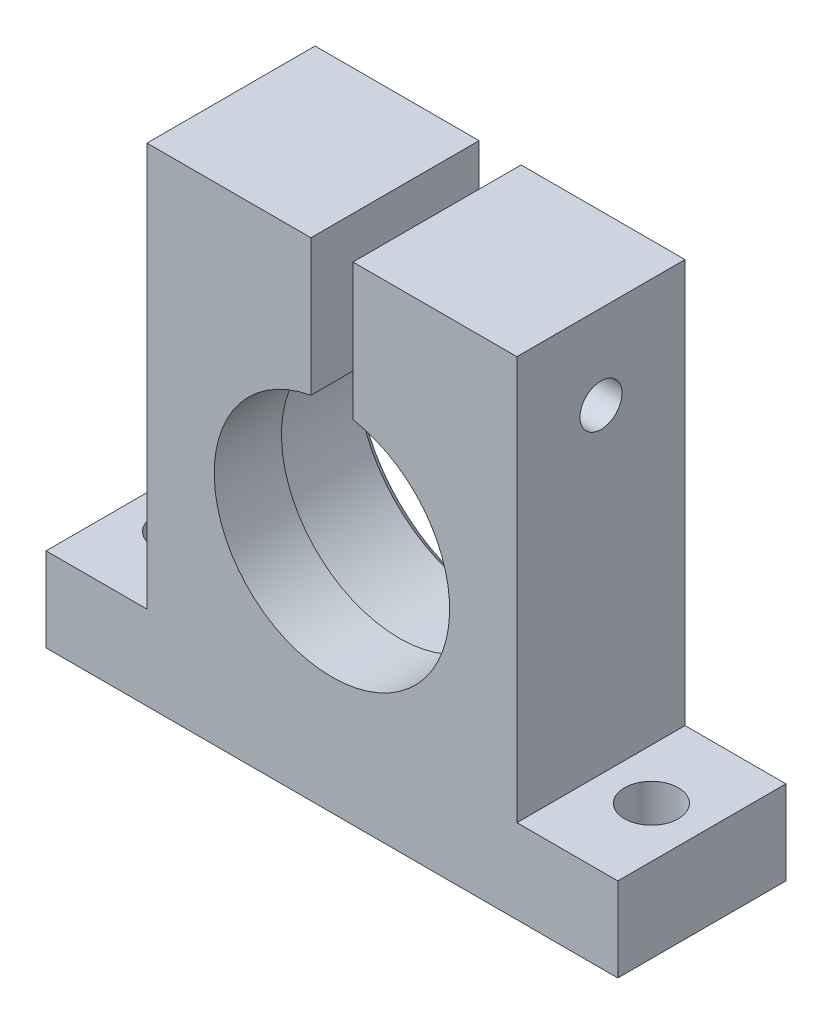
ISO-10303-21;
HEADER;
FILE_DESCRIPTION(('STEP AP214'),'2;1');
FILE_NAME('part.step','',(''),(''),'','','');
FILE_SCHEMA(('AUTOMOTIVE_DESIGN { 1 0 10303 214 1 1 1 1 }'));
ENDSEC;
DATA;
#1=APPLICATION_CONTEXT('core data for automotive mechanical design processes');
#2=APPLICATION_PROTOCOL_DEFINITION('international standard','automotive_design',2000,#1);
#3=PRODUCT_CONTEXT('',#1,'mechanical');
#4=PRODUCT('Part','Part','',(#3));
#5=PRODUCT_RELATED_PRODUCT_CATEGORY('part','',(#4));
#6=PRODUCT_DEFINITION_FORMATION('','',#4);
#7=PRODUCT_DEFINITION_CONTEXT('part definition',#1,'design');
#8=PRODUCT_DEFINITION('design','',#6,#7);
#9=PRODUCT_DEFINITION_SHAPE('','',#8);
#10=(LENGTH_UNIT() NAMED_UNIT(*) SI_UNIT(.MILLI.,.METRE.));
#11=(NAMED_UNIT(*) PLANE_ANGLE_UNIT() SI_UNIT($,.RADIAN.));
#12=(NAMED_UNIT(*) SI_UNIT($,.STERADIAN.) SOLID_ANGLE_UNIT());
#13=UNCERTAINTY_MEASURE_WITH_UNIT(LENGTH_MEASURE(1.E-05),#10,'distance_accuracy_value','');
#14=(GEOMETRIC_REPRESENTATION_CONTEXT(3) GLOBAL_UNCERTAINTY_ASSIGNED_CONTEXT((#13)) GLOBAL_UNIT_ASSIGNED_CONTEXT((#10,
#11,#12)) REPRESENTATION_CONTEXT('',''));
#15=CARTESIAN_POINT('',(0.,0.,0.));
#16=DIRECTION('',(0.,0.,1.));
#17=DIRECTION('',(1.,0.,0.));
#18=AXIS2_PLACEMENT_3D('',#15,#16,#17);
#19=CARTESIAN_POINT('',(-45.,15.,5.));
#20=DIRECTION('',(0.,-1.,0.));
#21=DIRECTION('',(-1.,0.,0.));
#22=AXIS2_PLACEMENT_3D('',#19,#20,#21);
#23=PLANE('',#22);
#24=DIRECTION('',(1.,0.,0.));
#25=VECTOR('',#24,1.);
#26=CARTESIAN_POINT('',(-45.,15.,5.));
#27=LINE('',#26,#25);
#28=CARTESIAN_POINT('',(-32.75,15.,5.));
#29=VERTEX_POINT('',#28);
#30=CARTESIAN_POINT('',(-23.,15.,5.));
#31=VERTEX_POINT('',#30);
#32=EDGE_CURVE('E290',#29,#31,#27,.T.);
#33=ORIENTED_EDGE('',*,*,#32,.T.);
#34=DIRECTION('',(0.,0.,-1.));
#35=VECTOR('',#34,1.);
#36=CARTESIAN_POINT('',(-23.,15.,5.));
#37=LINE('',#36,#35);
#38=CARTESIAN_POINT('',(-23.,15.,-5.));
#39=VERTEX_POINT('',#38);
#40=EDGE_CURVE('E185',#31,#39,#37,.T.);
#41=ORIENTED_EDGE('',*,*,#40,.T.);
#42=DIRECTION('',(1.,0.,0.));
#43=VECTOR('',#42,1.);
#44=CARTESIAN_POINT('',(-45.,15.,-5.));
#45=LINE('',#44,#43);
#46=CARTESIAN_POINT('',(-32.75,15.,-5.));
#47=VERTEX_POINT('',#46);
#48=EDGE_CURVE('E176',#47,#39,#45,.T.);
#49=ORIENTED_EDGE('',*,*,#48,.F.);
#50=DIRECTION('',(0.,0.,1.));
#51=VECTOR('',#50,1.);
#52=CARTESIAN_POINT('',(-32.75,15.,-5.));
#53=LINE('',#52,#51);
#54=EDGE_CURVE('E169',#47,#29,#53,.T.);
#55=ORIENTED_EDGE('',*,*,#54,.T.);
#56=EDGE_LOOP('',(#33,#41,#49,#55));
#57=FACE_BOUND('',#56,.T.);
#58=ADVANCED_FACE('F43',(#57),#23,.F.);
#59=CARTESIAN_POINT('',(-23.,-14.,5.));
#60=DIRECTION('',(-1.,0.,0.));
#61=DIRECTION('',(0.,0.,-1.));
#62=AXIS2_PLACEMENT_3D('',#59,#60,#61);
#63=PLANE('',#62);
#64=CARTESIAN_POINT('',(-23.,10.,0.));
#65=DIRECTION('',(1.,0.,0.));
#66=DIRECTION('',(0.,0.,-1.));
#67=AXIS2_PLACEMENT_3D('',#64,#65,#66);
#68=CIRCLE('',#67,1.24999999999999);
#69=CARTESIAN_POINT('',(-23.,10.,-1.24999999999999));
#70=VERTEX_POINT('',#69);
#71=EDGE_CURVE('E267',#70,#70,#68,.T.);
#72=ORIENTED_EDGE('',*,*,#71,.F.);
#73=EDGE_LOOP('',(#72));
#74=FACE_BOUND('',#73,.T.);
#75=DIRECTION('',(0.,0.,-1.));
#76=VECTOR('',#75,1.);
#77=CARTESIAN_POINT('',(-23.,-9.,5.));
#78=LINE('',#77,#76);
#79=CARTESIAN_POINT('',(-23.,-9.,5.));
#80=VERTEX_POINT('',#79);
#81=CARTESIAN_POINT('',(-23.,-9.,-5.));
#82=VERTEX_POINT('',#81);
#83=EDGE_CURVE('E270',#80,#82,#78,.T.);
#84=ORIENTED_EDGE('',*,*,#83,.T.);
#85=DIRECTION('',(0.,-1.,0.));
#86=VECTOR('',#85,1.);
#87=CARTESIAN_POINT('',(-23.,-14.,-5.));
#88=LINE('',#87,#86);
#89=EDGE_CURVE('E273',#39,#82,#88,.T.);
#90=ORIENTED_EDGE('',*,*,#89,.F.);
#91=ORIENTED_EDGE('',*,*,#40,.F.);
#92=DIRECTION('',(0.,-1.,0.));
#93=VECTOR('',#92,1.);
#94=CARTESIAN_POINT('',(-23.,-14.,5.));
#95=LINE('',#94,#93);
#96=EDGE_CURVE('E175',#31,#80,#95,.T.);
#97=ORIENTED_EDGE('',*,*,#96,.T.);
#98=EDGE_LOOP('',(#84,#90,#91,#97));
#99=FACE_BOUND('',#98,.T.);
#100=ADVANCED_FACE('F254',(#74,#99),#63,.F.);
#101=CARTESIAN_POINT('',(-45.,-14.,5.));
#102=DIRECTION('',(1.,0.,0.));
#103=DIRECTION('',(0.,0.,1.));
#104=AXIS2_PLACEMENT_3D('',#101,#102,#103);
#105=PLANE('',#104);
#106=CARTESIAN_POINT('',(-45.,10.,0.));
#107=DIRECTION('',(1.,0.,0.));
#108=DIRECTION('',(0.,0.,-1.));
#109=AXIS2_PLACEMENT_3D('',#106,#107,#108);
#110=CIRCLE('',#109,3.25);
#111=CARTESIAN_POINT('',(-45.,10.,-3.25));
#112=VERTEX_POINT('',#111);
#113=EDGE_CURVE('E377',#112,#112,#110,.T.);
#114=ORIENTED_EDGE('',*,*,#113,.T.);
#115=EDGE_LOOP('',(#114));
#116=FACE_BOUND('',#115,.T.);
#117=DIRECTION('',(0.,0.,1.));
#118=VECTOR('',#117,1.);
#119=CARTESIAN_POINT('',(-45.,-9.00000000000001,5.));
#120=LINE('',#119,#118);
#121=CARTESIAN_POINT('',(-45.,-9.00000000000001,-5.));
#122=VERTEX_POINT('',#121);
#123=CARTESIAN_POINT('',(-45.,-9.00000000000001,5.));
#124=VERTEX_POINT('',#123);
#125=EDGE_CURVE('E276',#122,#124,#120,.T.);
#126=ORIENTED_EDGE('',*,*,#125,.T.);
#127=DIRECTION('',(0.,1.,0.));
#128=VECTOR('',#127,1.);
#129=CARTESIAN_POINT('',(-45.,-14.,5.));
#130=LINE('',#129,#128);
#131=CARTESIAN_POINT('',(-45.,15.,5.));
#132=VERTEX_POINT('',#131);
#133=EDGE_CURVE('E287',#124,#132,#130,.T.);
#134=ORIENTED_EDGE('',*,*,#133,.T.);
#135=DIRECTION('',(0.,0.,-1.));
#136=VECTOR('',#135,1.);
#137=CARTESIAN_POINT('',(-45.,15.,5.));
#138=LINE('',#137,#136);
#139=CARTESIAN_POINT('',(-45.,15.,-5.));
#140=VERTEX_POINT('',#139);
#141=EDGE_CURVE('E188',#132,#140,#138,.T.);
#142=ORIENTED_EDGE('',*,*,#141,.T.);
#143=DIRECTION('',(0.,1.,0.));
#144=VECTOR('',#143,1.);
#145=CARTESIAN_POINT('',(-45.,-14.,-5.));
#146=LINE('',#145,#144);
#147=EDGE_CURVE('E173',#122,#140,#146,.T.);
#148=ORIENTED_EDGE('',*,*,#147,.F.);
#149=EDGE_LOOP('',(#126,#134,#142,#148));
#150=FACE_BOUND('',#149,.T.);
#151=ADVANCED_FACE('F251',(#116,#150),#105,.F.);
#152=CARTESIAN_POINT('',(-45.,-14.,5.));
#153=DIRECTION('',(0.,1.,0.));
#154=DIRECTION('',(1.,0.,0.));
#155=AXIS2_PLACEMENT_3D('',#152,#153,#154);
#156=PLANE('',#155);
#157=CARTESIAN_POINT('',(-20.,-14.,0.));
#158=DIRECTION('',(0.,-1.,0.));
#159=DIRECTION('',(0.,0.,1.));
#160=AXIS2_PLACEMENT_3D('',#157,#158,#159);
#161=CIRCLE('',#160,1.6);
#162=CARTESIAN_POINT('',(-20.,-14.,1.6));
#163=VERTEX_POINT('',#162);
#164=EDGE_CURVE('E343',#163,#163,#161,.T.);
#165=ORIENTED_EDGE('',*,*,#164,.F.);
#166=EDGE_LOOP('',(#165));
#167=FACE_BOUND('',#166,.T.);
#168=CARTESIAN_POINT('',(-48.,-14.,0.));
#169=DIRECTION('',(0.,-1.,0.));
#170=DIRECTION('',(0.,0.,1.));
#171=AXIS2_PLACEMENT_3D('',#168,#169,#170);
#172=CIRCLE('',#171,1.6);
#173=CARTESIAN_POINT('',(-48.,-14.,1.6));
#174=VERTEX_POINT('',#173);
#175=EDGE_CURVE('E337',#174,#174,#172,.T.);
#176=ORIENTED_EDGE('',*,*,#175,.F.);
#177=EDGE_LOOP('',(#176));
#178=FACE_BOUND('',#177,.T.);
#179=DIRECTION('',(-1.,0.,0.));
#180=VECTOR('',#179,1.);
#181=CARTESIAN_POINT('',(-45.,-14.,-5.));
#182=LINE('',#181,#180);
#183=CARTESIAN_POINT('',(-17.,-14.,-5.));
#184=VERTEX_POINT('',#183);
#185=CARTESIAN_POINT('',(-51.,-14.,-5.));
#186=VERTEX_POINT('',#185);
#187=EDGE_CURVE('E278',#184,#186,#182,.T.);
#188=ORIENTED_EDGE('',*,*,#187,.F.);
#189=DIRECTION('',(0.,0.,-1.));
#190=VECTOR('',#189,1.);
#191=CARTESIAN_POINT('',(-17.,-14.,-5.));
#192=LINE('',#191,#190);
#193=CARTESIAN_POINT('',(-17.,-14.,5.));
#194=VERTEX_POINT('',#193);
#195=EDGE_CURVE('E302',#194,#184,#192,.T.);
#196=ORIENTED_EDGE('',*,*,#195,.F.);
#197=DIRECTION('',(-1.,0.,0.));
#198=VECTOR('',#197,1.);
#199=CARTESIAN_POINT('',(-45.,-14.,5.));
#200=LINE('',#199,#198);
#201=CARTESIAN_POINT('',(-51.,-14.,5.));
#202=VERTEX_POINT('',#201);
#203=EDGE_CURVE('E179',#194,#202,#200,.T.);
#204=ORIENTED_EDGE('',*,*,#203,.T.);
#205=DIRECTION('',(0.,0.,1.));
#206=VECTOR('',#205,1.);
#207=CARTESIAN_POINT('',(-51.,-14.,-5.));
#208=LINE('',#207,#206);
#209=EDGE_CURVE('E304',#186,#202,#208,.T.);
#210=ORIENTED_EDGE('',*,*,#209,.F.);
#211=EDGE_LOOP('',(#188,#196,#204,#210));
#212=FACE_BOUND('',#211,.T.);
#213=ADVANCED_FACE('F250',(#167,#178,#212),#156,.F.);
#214=CARTESIAN_POINT('',(-35.25,15.,-5.));
#215=VERTEX_POINT('',#214);
#216=EDGE_CURVE('E166',#140,#215,#45,.T.);
#217=ORIENTED_EDGE('',*,*,#216,.F.);
#218=ORIENTED_EDGE('',*,*,#141,.F.);
#219=CARTESIAN_POINT('',(-35.25,15.,5.));
#220=VERTEX_POINT('',#219);
#221=EDGE_CURVE('E168',#132,#220,#27,.T.);
#222=ORIENTED_EDGE('',*,*,#221,.T.);
#223=DIRECTION('',(0.,0.,1.));
#224=VECTOR('',#223,1.);
#225=CARTESIAN_POINT('',(-35.25,15.,-5.));
#226=LINE('',#225,#224);
#227=EDGE_CURVE('E157',#215,#220,#226,.T.);
#228=ORIENTED_EDGE('',*,*,#227,.F.);
#229=EDGE_LOOP('',(#217,#218,#222,#228));
#230=FACE_BOUND('',#229,.T.);
#231=ADVANCED_FACE('F164',(#230),#23,.F.);
#232=CARTESIAN_POINT('',(-34.,0.,5.));
#233=DIRECTION('',(0.,0.,1.));
#234=DIRECTION('',(-1.,0.,0.));
#235=AXIS2_PLACEMENT_3D('',#232,#233,#234);
#236=PLANE('',#235);
#237=DIRECTION('',(0.,-1.,0.));
#238=VECTOR('',#237,1.);
#239=CARTESIAN_POINT('',(-32.75,6.88748865697795,5.));
#240=LINE('',#239,#238);
#241=CARTESIAN_POINT('',(-32.75,6.88748865697795,5.));
#242=VERTEX_POINT('',#241);
#243=EDGE_CURVE('E363',#29,#242,#240,.T.);
#244=ORIENTED_EDGE('',*,*,#243,.T.);
#245=CARTESIAN_POINT('',(-34.,0.,5.));
#246=DIRECTION('',(0.,0.,1.));
#247=DIRECTION('',(1.,0.,0.));
#248=AXIS2_PLACEMENT_3D('',#245,#246,#247);
#249=CIRCLE('',#248,7.);
#250=CARTESIAN_POINT('',(-35.25,6.88748865697795,5.));
#251=VERTEX_POINT('',#250);
#252=EDGE_CURVE('E331',#251,#242,#249,.T.);
#253=ORIENTED_EDGE('',*,*,#252,.F.);
#254=DIRECTION('',(0.,1.,0.));
#255=VECTOR('',#254,1.);
#256=CARTESIAN_POINT('',(-35.25,6.88748865697795,5.));
#257=LINE('',#256,#255);
#258=EDGE_CURVE('E361',#251,#220,#257,.T.);
#259=ORIENTED_EDGE('',*,*,#258,.T.);
#260=ORIENTED_EDGE('',*,*,#221,.F.);
#261=ORIENTED_EDGE('',*,*,#133,.F.);
#262=DIRECTION('',(1.,0.,0.));
#263=VECTOR('',#262,1.);
#264=CARTESIAN_POINT('',(-51.,-9.00000000000001,5.));
#265=LINE('',#264,#263);
#266=CARTESIAN_POINT('',(-51.,-9.00000000000001,5.));
#267=VERTEX_POINT('',#266);
#268=EDGE_CURVE('E318',#267,#124,#265,.T.);
#269=ORIENTED_EDGE('',*,*,#268,.F.);
#270=DIRECTION('',(0.,-1.,0.));
#271=VECTOR('',#270,1.);
#272=CARTESIAN_POINT('',(-51.,-9.00000000000001,5.));
#273=LINE('',#272,#271);
#274=EDGE_CURVE('E316',#267,#202,#273,.T.);
#275=ORIENTED_EDGE('',*,*,#274,.T.);
#276=ORIENTED_EDGE('',*,*,#203,.F.);
#277=DIRECTION('',(0.,-1.,0.));
#278=VECTOR('',#277,1.);
#279=CARTESIAN_POINT('',(-17.,-9.,5.));
#280=LINE('',#279,#278);
#281=CARTESIAN_POINT('',(-17.,-9.,5.));
#282=VERTEX_POINT('',#281);
#283=EDGE_CURVE('E281',#282,#194,#280,.T.);
#284=ORIENTED_EDGE('',*,*,#283,.F.);
#285=EDGE_CURVE('E319',#80,#282,#265,.T.);
#286=ORIENTED_EDGE('',*,*,#285,.F.);
#287=ORIENTED_EDGE('',*,*,#96,.F.);
#288=ORIENTED_EDGE('',*,*,#32,.F.);
#289=EDGE_LOOP('',(#244,#253,#259,#260,#261,#269,#275,#276,#284,#286,#287,#288));
#290=FACE_BOUND('',#289,.T.);
#291=ADVANCED_FACE('F242',(#290),#236,.T.);
#292=CARTESIAN_POINT('',(-34.,0.,-5.));
#293=DIRECTION('',(0.,0.,1.));
#294=DIRECTION('',(-1.,0.,0.));
#295=AXIS2_PLACEMENT_3D('',#292,#293,#294);
#296=PLANE('',#295);
#297=DIRECTION('',(0.,-1.,0.));
#298=VECTOR('',#297,1.);
#299=CARTESIAN_POINT('',(-32.75,6.88748865697795,-5.));
#300=LINE('',#299,#298);
#301=CARTESIAN_POINT('',(-32.75,8.4075858604001,-5.));
#302=VERTEX_POINT('',#301);
#303=EDGE_CURVE('E161',#47,#302,#300,.T.);
#304=ORIENTED_EDGE('',*,*,#303,.F.);
#305=ORIENTED_EDGE('',*,*,#48,.T.);
#306=ORIENTED_EDGE('',*,*,#89,.T.);
#307=DIRECTION('',(-1.,0.,0.));
#308=VECTOR('',#307,1.);
#309=CARTESIAN_POINT('',(-51.,-9.00000000000001,-5.));
#310=LINE('',#309,#308);
#311=CARTESIAN_POINT('',(-17.,-9.,-5.));
#312=VERTEX_POINT('',#311);
#313=EDGE_CURVE('E327',#312,#82,#310,.T.);
#314=ORIENTED_EDGE('',*,*,#313,.F.);
#315=DIRECTION('',(0.,-1.,0.));
#316=VECTOR('',#315,1.);
#317=CARTESIAN_POINT('',(-17.,-9.,-5.));
#318=LINE('',#317,#316);
#319=EDGE_CURVE('E297',#312,#184,#318,.T.);
#320=ORIENTED_EDGE('',*,*,#319,.T.);
#321=ORIENTED_EDGE('',*,*,#187,.T.);
#322=DIRECTION('',(0.,-1.,0.));
#323=VECTOR('',#322,1.);
#324=CARTESIAN_POINT('',(-51.,-9.00000000000001,-5.));
#325=LINE('',#324,#323);
#326=CARTESIAN_POINT('',(-51.,-9.00000000000001,-5.));
#327=VERTEX_POINT('',#326);
#328=EDGE_CURVE('E294',#327,#186,#325,.T.);
#329=ORIENTED_EDGE('',*,*,#328,.F.);
#330=EDGE_CURVE('E309',#122,#327,#310,.T.);
#331=ORIENTED_EDGE('',*,*,#330,.F.);
#332=ORIENTED_EDGE('',*,*,#147,.T.);
#333=ORIENTED_EDGE('',*,*,#216,.T.);
#334=DIRECTION('',(0.,1.,0.));
#335=VECTOR('',#334,1.);
#336=CARTESIAN_POINT('',(-35.25,6.88748865697795,-5.));
#337=LINE('',#336,#335);
#338=CARTESIAN_POINT('',(-35.25,8.4075858604001,-5.));
#339=VERTEX_POINT('',#338);
#340=EDGE_CURVE('E153',#339,#215,#337,.T.);
#341=ORIENTED_EDGE('',*,*,#340,.F.);
#342=CARTESIAN_POINT('',(-34.,0.,-5.));
#343=DIRECTION('',(0.,0.,-1.));
#344=DIRECTION('',(-1.,0.,0.));
#345=AXIS2_PLACEMENT_3D('',#342,#343,#344);
#346=CIRCLE('',#345,8.49999999999999);
#347=EDGE_CURVE('E57',#302,#339,#346,.T.);
#348=ORIENTED_EDGE('',*,*,#347,.F.);
#349=EDGE_LOOP('',(#304,#305,#306,#314,#320,#321,#329,#331,#332,#333,#341,#348));
#350=FACE_BOUND('',#349,.T.);
#351=ADVANCED_FACE('F171',(#350),#296,.F.);
#352=CARTESIAN_POINT('',(-51.,-9.00000000000001,-5.));
#353=DIRECTION('',(-1.,0.,0.));
#354=DIRECTION('',(0.,1.,0.));
#355=AXIS2_PLACEMENT_3D('',#352,#353,#354);
#356=PLANE('',#355);
#357=ORIENTED_EDGE('',*,*,#209,.T.);
#358=ORIENTED_EDGE('',*,*,#274,.F.);
#359=DIRECTION('',(0.,0.,1.));
#360=VECTOR('',#359,1.);
#361=CARTESIAN_POINT('',(-51.,-9.00000000000001,-5.));
#362=LINE('',#361,#360);
#363=EDGE_CURVE('E324',#327,#267,#362,.T.);
#364=ORIENTED_EDGE('',*,*,#363,.F.);
#365=ORIENTED_EDGE('',*,*,#328,.T.);
#366=EDGE_LOOP('',(#357,#358,#364,#365));
#367=FACE_BOUND('',#366,.T.);
#368=ADVANCED_FACE('F235',(#367),#356,.T.);
#369=CARTESIAN_POINT('',(-34.,-9.00000000000001,0.));
#370=DIRECTION('',(0.,-1.,0.));
#371=DIRECTION('',(-1.,0.,0.));
#372=AXIS2_PLACEMENT_3D('',#369,#370,#371);
#373=PLANE('',#372);
#374=CARTESIAN_POINT('',(-48.,-9.00000000000001,0.));
#375=DIRECTION('',(0.,-1.,0.));
#376=DIRECTION('',(0.,0.,1.));
#377=AXIS2_PLACEMENT_3D('',#374,#375,#376);
#378=CIRCLE('',#377,1.6);
#379=CARTESIAN_POINT('',(-48.,-9.00000000000001,1.6));
#380=VERTEX_POINT('',#379);
#381=EDGE_CURVE('E340',#380,#380,#378,.T.);
#382=ORIENTED_EDGE('',*,*,#381,.T.);
#383=EDGE_LOOP('',(#382));
#384=FACE_BOUND('',#383,.T.);
#385=ORIENTED_EDGE('',*,*,#330,.T.);
#386=ORIENTED_EDGE('',*,*,#363,.T.);
#387=ORIENTED_EDGE('',*,*,#268,.T.);
#388=ORIENTED_EDGE('',*,*,#125,.F.);
#389=EDGE_LOOP('',(#385,#386,#387,#388));
#390=FACE_BOUND('',#389,.T.);
#391=ADVANCED_FACE('F233',(#384,#390),#373,.F.);
#392=CARTESIAN_POINT('',(-20.,-9.,0.));
#393=DIRECTION('',(0.,-1.,0.));
#394=DIRECTION('',(0.,0.,1.));
#395=AXIS2_PLACEMENT_3D('',#392,#393,#394);
#396=CIRCLE('',#395,1.6);
#397=CARTESIAN_POINT('',(-20.,-9.,1.6));
#398=VERTEX_POINT('',#397);
#399=EDGE_CURVE('E346',#398,#398,#396,.T.);
#400=ORIENTED_EDGE('',*,*,#399,.T.);
#401=EDGE_LOOP('',(#400));
#402=FACE_BOUND('',#401,.T.);
#403=ORIENTED_EDGE('',*,*,#285,.T.);
#404=DIRECTION('',(0.,0.,-1.));
#405=VECTOR('',#404,1.);
#406=CARTESIAN_POINT('',(-17.,-9.,-5.));
#407=LINE('',#406,#405);
#408=EDGE_CURVE('E307',#282,#312,#407,.T.);
#409=ORIENTED_EDGE('',*,*,#408,.T.);
#410=ORIENTED_EDGE('',*,*,#313,.T.);
#411=ORIENTED_EDGE('',*,*,#83,.F.);
#412=EDGE_LOOP('',(#403,#409,#410,#411));
#413=FACE_BOUND('',#412,.T.);
#414=ADVANCED_FACE('F230',(#402,#413),#373,.F.);
#415=CARTESIAN_POINT('',(-17.,-9.,-5.));
#416=DIRECTION('',(1.,0.,0.));
#417=DIRECTION('',(0.,-1.,0.));
#418=AXIS2_PLACEMENT_3D('',#415,#416,#417);
#419=PLANE('',#418);
#420=ORIENTED_EDGE('',*,*,#195,.T.);
#421=ORIENTED_EDGE('',*,*,#319,.F.);
#422=ORIENTED_EDGE('',*,*,#408,.F.);
#423=ORIENTED_EDGE('',*,*,#283,.T.);
#424=EDGE_LOOP('',(#420,#421,#422,#423));
#425=FACE_BOUND('',#424,.T.);
#426=ADVANCED_FACE('F228',(#425),#419,.T.);
#427=CARTESIAN_POINT('',(-34.,0.,1.));
#428=DIRECTION('',(0.,0.,1.));
#429=DIRECTION('',(-1.,0.,0.));
#430=AXIS2_PLACEMENT_3D('',#427,#428,#429);
#431=PLANE('',#430);
#432=CARTESIAN_POINT('',(-34.,0.,1.));
#433=DIRECTION('',(0.,0.,1.));
#434=DIRECTION('',(1.,0.,0.));
#435=AXIS2_PLACEMENT_3D('',#432,#433,#434);
#436=CIRCLE('',#435,8.);
#437=CARTESIAN_POINT('',(-35.25,7.90174031463954,1.));
#438=VERTEX_POINT('',#437);
#439=CARTESIAN_POINT('',(-32.75,7.90174031463954,1.));
#440=VERTEX_POINT('',#439);
#441=EDGE_CURVE('E311',#438,#440,#436,.T.);
#442=ORIENTED_EDGE('',*,*,#441,.F.);
#443=DIRECTION('',(0.,1.,0.));
#444=VECTOR('',#443,1.);
#445=CARTESIAN_POINT('',(-35.25,0.,1.));
#446=LINE('',#445,#444);
#447=CARTESIAN_POINT('',(-35.25,6.88748865697795,1.));
#448=VERTEX_POINT('',#447);
#449=EDGE_CURVE('E354',#448,#438,#446,.T.);
#450=ORIENTED_EDGE('',*,*,#449,.F.);
#451=CARTESIAN_POINT('',(-34.,0.,1.));
#452=DIRECTION('',(0.,0.,1.));
#453=DIRECTION('',(1.,0.,0.));
#454=AXIS2_PLACEMENT_3D('',#451,#452,#453);
#455=CIRCLE('',#454,7.);
#456=CARTESIAN_POINT('',(-32.75,6.88748865697795,1.));
#457=VERTEX_POINT('',#456);
#458=EDGE_CURVE('E334',#448,#457,#455,.T.);
#459=ORIENTED_EDGE('',*,*,#458,.T.);
#460=DIRECTION('',(0.,-1.,0.));
#461=VECTOR('',#460,1.);
#462=CARTESIAN_POINT('',(-32.75,0.,1.));
#463=LINE('',#462,#461);
#464=EDGE_CURVE('E349',#440,#457,#463,.T.);
#465=ORIENTED_EDGE('',*,*,#464,.F.);
#466=EDGE_LOOP('',(#442,#450,#459,#465));
#467=FACE_BOUND('',#466,.T.);
#468=ADVANCED_FACE('F224',(#467),#431,.F.);
#469=CARTESIAN_POINT('',(-34.,0.,-5.));
#470=DIRECTION('',(0.,0.,-1.));
#471=DIRECTION('',(1.,0.,0.));
#472=AXIS2_PLACEMENT_3D('',#469,#470,#471);
#473=CYLINDRICAL_SURFACE('',#472,7.99999999999999);
#474=DIRECTION('',(0.,0.,-1.));
#475=VECTOR('',#474,1.);
#476=CARTESIAN_POINT('',(-35.25,7.90174031463954,-5.));
#477=LINE('',#476,#475);
#478=CARTESIAN_POINT('',(-35.25,7.90174031463954,-4.50000000000001));
#479=VERTEX_POINT('',#478);
#480=EDGE_CURVE('E357',#438,#479,#477,.T.);
#481=ORIENTED_EDGE('',*,*,#480,.F.);
#482=ORIENTED_EDGE('',*,*,#441,.T.);
#483=DIRECTION('',(0.,0.,-1.));
#484=VECTOR('',#483,1.);
#485=CARTESIAN_POINT('',(-32.75,7.90174031463954,-5.));
#486=LINE('',#485,#484);
#487=CARTESIAN_POINT('',(-32.75,7.90174031463954,-4.50000000000001));
#488=VERTEX_POINT('',#487);
#489=EDGE_CURVE('E352',#488,#440,#486,.F.);
#490=ORIENTED_EDGE('',*,*,#489,.F.);
#491=CARTESIAN_POINT('',(-34.,0.,-4.50000000000001));
#492=DIRECTION('',(0.,0.,-1.));
#493=DIRECTION('',(-1.,0.,0.));
#494=AXIS2_PLACEMENT_3D('',#491,#492,#493);
#495=CIRCLE('',#494,7.99999999999999);
#496=EDGE_CURVE('E194',#479,#488,#495,.F.);
#497=ORIENTED_EDGE('',*,*,#496,.F.);
#498=EDGE_LOOP('',(#481,#482,#490,#497));
#499=FACE_BOUND('',#498,.T.);
#500=ADVANCED_FACE('F220',(#499),#473,.F.);
#501=CARTESIAN_POINT('',(-34.,0.,1.));
#502=DIRECTION('',(0.,0.,-1.));
#503=DIRECTION('',(1.,0.,0.));
#504=AXIS2_PLACEMENT_3D('',#501,#502,#503);
#505=CYLINDRICAL_SURFACE('',#504,7.);
#506=ORIENTED_EDGE('',*,*,#458,.F.);
#507=DIRECTION('',(0.,0.,-1.));
#508=VECTOR('',#507,1.);
#509=CARTESIAN_POINT('',(-35.25,6.88748865697795,1.));
#510=LINE('',#509,#508);
#511=EDGE_CURVE('E190',#251,#448,#510,.T.);
#512=ORIENTED_EDGE('',*,*,#511,.F.);
#513=ORIENTED_EDGE('',*,*,#252,.T.);
#514=DIRECTION('',(0.,0.,-1.));
#515=VECTOR('',#514,1.);
#516=CARTESIAN_POINT('',(-32.75,6.88748865697795,1.));
#517=LINE('',#516,#515);
#518=EDGE_CURVE('E192',#457,#242,#517,.F.);
#519=ORIENTED_EDGE('',*,*,#518,.F.);
#520=EDGE_LOOP('',(#506,#512,#513,#519));
#521=FACE_BOUND('',#520,.T.);
#522=ADVANCED_FACE('F216',(#521),#505,.F.);
#523=CARTESIAN_POINT('',(-48.,-9.00000000000001,0.));
#524=DIRECTION('',(0.,1.,0.));
#525=DIRECTION('',(0.,0.,1.));
#526=AXIS2_PLACEMENT_3D('',#523,#524,#525);
#527=CYLINDRICAL_SURFACE('',#526,1.6);
#528=ORIENTED_EDGE('',*,*,#175,.T.);
#529=EDGE_LOOP('',(#528));
#530=FACE_BOUND('',#529,.T.);
#531=ORIENTED_EDGE('',*,*,#381,.F.);
#532=EDGE_LOOP('',(#531));
#533=FACE_BOUND('',#532,.T.);
#534=ADVANCED_FACE('F212',(#530,#533),#527,.F.);
#535=CARTESIAN_POINT('',(-20.,-9.,0.));
#536=DIRECTION('',(0.,1.,0.));
#537=DIRECTION('',(0.,0.,1.));
#538=AXIS2_PLACEMENT_3D('',#535,#536,#537);
#539=CYLINDRICAL_SURFACE('',#538,1.6);
#540=ORIENTED_EDGE('',*,*,#164,.T.);
#541=EDGE_LOOP('',(#540));
#542=FACE_BOUND('',#541,.T.);
#543=ORIENTED_EDGE('',*,*,#399,.F.);
#544=EDGE_LOOP('',(#543));
#545=FACE_BOUND('',#544,.T.);
#546=ADVANCED_FACE('F209',(#542,#545),#539,.F.);
#547=CARTESIAN_POINT('',(-35.25,6.88748865697795,-5.));
#548=DIRECTION('',(-1.,0.,0.));
#549=DIRECTION('',(0.,0.,-1.));
#550=AXIS2_PLACEMENT_3D('',#547,#548,#549);
#551=PLANE('',#550);
#552=CARTESIAN_POINT('',(-35.25,10.,0.));
#553=DIRECTION('',(1.,0.,0.));
#554=DIRECTION('',(0.,0.,-1.));
#555=AXIS2_PLACEMENT_3D('',#552,#553,#554);
#556=CIRCLE('',#555,1.6);
#557=CARTESIAN_POINT('',(-35.25,10.,-1.6));
#558=VERTEX_POINT('',#557);
#559=EDGE_CURVE('E365',#558,#558,#556,.T.);
#560=ORIENTED_EDGE('',*,*,#559,.F.);
#561=EDGE_LOOP('',(#560));
#562=FACE_BOUND('',#561,.T.);
#563=ORIENTED_EDGE('',*,*,#340,.T.);
#564=ORIENTED_EDGE('',*,*,#227,.T.);
#565=ORIENTED_EDGE('',*,*,#258,.F.);
#566=ORIENTED_EDGE('',*,*,#511,.T.);
#567=ORIENTED_EDGE('',*,*,#449,.T.);
#568=ORIENTED_EDGE('',*,*,#480,.T.);
#569=CARTESIAN_POINT('',(-35.25,8.4075858604001,-5.));
#570=CARTESIAN_POINT('',(-35.25,8.3233079630533,-4.91663662606483));
#571=CARTESIAN_POINT('',(-35.25,8.23901521894041,-4.83328827247064));
#572=CARTESIAN_POINT('',(-35.25,8.07040003702028,-4.66662160580392));
#573=CARTESIAN_POINT('',(-35.25,7.98607759921298,-4.58330329273145));
#574=CARTESIAN_POINT('',(-35.25,7.90174031463954,-4.50000000000001));
#575=B_SPLINE_CURVE_WITH_KNOTS('',3,(#569,#570,#571,#572,#573,#574),.UNSPECIFIED.,.F.,.F.,(4,2,
4),(0.,0.355626113794366,0.711252228272866),.UNSPECIFIED.);
#576=EDGE_CURVE('E11',#339,#479,#575,.T.);
#577=ORIENTED_EDGE('',*,*,#576,.F.);
#578=EDGE_LOOP('',(#563,#564,#565,#566,#567,#568,#577));
#579=FACE_BOUND('',#578,.T.);
#580=ADVANCED_FACE('F155',(#562,#579),#551,.F.);
#581=CARTESIAN_POINT('',(-32.75,6.88748865697795,-5.));
#582=DIRECTION('',(1.,0.,0.));
#583=DIRECTION('',(0.,0.,1.));
#584=AXIS2_PLACEMENT_3D('',#581,#582,#583);
#585=PLANE('',#584);
#586=CARTESIAN_POINT('',(-32.75,10.,0.));
#587=DIRECTION('',(1.,0.,0.));
#588=DIRECTION('',(0.,1.,0.));
#589=AXIS2_PLACEMENT_3D('',#586,#587,#588);
#590=CIRCLE('',#589,1.24999999999999);
#591=CARTESIAN_POINT('',(-32.75,11.25,0.));
#592=VERTEX_POINT('',#591);
#593=EDGE_CURVE('E380',#592,#592,#590,.T.);
#594=ORIENTED_EDGE('',*,*,#593,.T.);
#595=EDGE_LOOP('',(#594));
#596=FACE_BOUND('',#595,.T.);
#597=ORIENTED_EDGE('',*,*,#489,.T.);
#598=ORIENTED_EDGE('',*,*,#464,.T.);
#599=ORIENTED_EDGE('',*,*,#518,.T.);
#600=ORIENTED_EDGE('',*,*,#243,.F.);
#601=ORIENTED_EDGE('',*,*,#54,.F.);
#602=ORIENTED_EDGE('',*,*,#303,.T.);
#603=CARTESIAN_POINT('',(-32.75,7.90174031463954,-4.50000000000001));
#604=CARTESIAN_POINT('',(-32.75,7.98607759921298,-4.58330329273145));
#605=CARTESIAN_POINT('',(-32.75,8.07040003702028,-4.66662160580392));
#606=CARTESIAN_POINT('',(-32.75,8.23901521894041,-4.83328827247064));
#607=CARTESIAN_POINT('',(-32.75,8.3233079630533,-4.91663662606483));
#608=CARTESIAN_POINT('',(-32.75,8.4075858604001,-5.));
#609=B_SPLINE_CURVE_WITH_KNOTS('',3,(#603,#604,#605,#606,#607,#608),.UNSPECIFIED.,.F.,.F.,(4,2,
4),(0.,0.355626114478499,0.711252228272866),.UNSPECIFIED.);
#610=EDGE_CURVE('E69',#488,#302,#609,.T.);
#611=ORIENTED_EDGE('',*,*,#610,.F.);
#612=EDGE_LOOP('',(#597,#598,#599,#600,#601,#602,#611));
#613=FACE_BOUND('',#612,.T.);
#614=ADVANCED_FACE('F201',(#596,#613),#585,.F.);
#615=CARTESIAN_POINT('',(-45.,10.,0.));
#616=DIRECTION('',(-1.,0.,0.));
#617=DIRECTION('',(0.,0.,-1.));
#618=AXIS2_PLACEMENT_3D('',#615,#616,#617);
#619=CYLINDRICAL_SURFACE('',#618,1.6);
#620=ORIENTED_EDGE('',*,*,#559,.T.);
#621=EDGE_LOOP('',(#620));
#622=FACE_BOUND('',#621,.T.);
#623=CARTESIAN_POINT('',(-42.,10.,0.));
#624=DIRECTION('',(1.,0.,0.));
#625=DIRECTION('',(0.,0.,-1.));
#626=AXIS2_PLACEMENT_3D('',#623,#624,#625);
#627=CIRCLE('',#626,1.6);
#628=CARTESIAN_POINT('',(-42.,10.,-1.6));
#629=VERTEX_POINT('',#628);
#630=EDGE_CURVE('E371',#629,#629,#627,.T.);
#631=ORIENTED_EDGE('',*,*,#630,.F.);
#632=EDGE_LOOP('',(#631));
#633=FACE_BOUND('',#632,.T.);
#634=ADVANCED_FACE('F205',(#622,#633),#619,.F.);
#635=CARTESIAN_POINT('',(-42.,11.6,0.));
#636=DIRECTION('',(1.,0.,0.));
#637=DIRECTION('',(0.,0.,1.));
#638=AXIS2_PLACEMENT_3D('',#635,#636,#637);
#639=PLANE('',#638);
#640=ORIENTED_EDGE('',*,*,#630,.T.);
#641=EDGE_LOOP('',(#640));
#642=FACE_BOUND('',#641,.T.);
#643=CARTESIAN_POINT('',(-42.,10.,0.));
#644=DIRECTION('',(1.,0.,0.));
#645=DIRECTION('',(0.,0.,-1.));
#646=AXIS2_PLACEMENT_3D('',#643,#644,#645);
#647=CIRCLE('',#646,3.25);
#648=CARTESIAN_POINT('',(-42.,10.,-3.25));
#649=VERTEX_POINT('',#648);
#650=EDGE_CURVE('E374',#649,#649,#647,.T.);
#651=ORIENTED_EDGE('',*,*,#650,.F.);
#652=EDGE_LOOP('',(#651));
#653=FACE_BOUND('',#652,.T.);
#654=ADVANCED_FACE('F396',(#642,#653),#639,.F.);
#655=CARTESIAN_POINT('',(-45.,10.,0.));
#656=DIRECTION('',(-1.,0.,0.));
#657=DIRECTION('',(0.,0.,-1.));
#658=AXIS2_PLACEMENT_3D('',#655,#656,#657);
#659=CYLINDRICAL_SURFACE('',#658,3.25);
#660=ORIENTED_EDGE('',*,*,#650,.T.);
#661=EDGE_LOOP('',(#660));
#662=FACE_BOUND('',#661,.T.);
#663=ORIENTED_EDGE('',*,*,#113,.F.);
#664=EDGE_LOOP('',(#663));
#665=FACE_BOUND('',#664,.T.);
#666=ADVANCED_FACE('F391',(#662,#665),#659,.F.);
#667=CARTESIAN_POINT('',(-34.,0.,-4.50000000000001));
#668=DIRECTION('',(0.,0.,-1.));
#669=DIRECTION('',(1.,0.,0.));
#670=AXIS2_PLACEMENT_3D('',#667,#668,#669);
#671=CONICAL_SURFACE('',#670,7.99999999999999,0.785398163397455);
#672=ORIENTED_EDGE('',*,*,#576,.T.);
#673=ORIENTED_EDGE('',*,*,#496,.T.);
#674=ORIENTED_EDGE('',*,*,#610,.T.);
#675=ORIENTED_EDGE('',*,*,#347,.T.);
#676=EDGE_LOOP('',(#672,#673,#674,#675));
#677=FACE_BOUND('',#676,.T.);
#678=ADVANCED_FACE('F45',(#677),#671,.F.);
#679=CARTESIAN_POINT('',(-23.,10.,0.));
#680=DIRECTION('',(1.,0.,0.));
#681=DIRECTION('',(0.,0.,-1.));
#682=AXIS2_PLACEMENT_3D('',#679,#680,#681);
#683=CYLINDRICAL_SURFACE('',#682,1.24999999999999);
#684=ORIENTED_EDGE('',*,*,#593,.F.);
#685=EDGE_LOOP('',(#684));
#686=FACE_BOUND('',#685,.T.);
#687=ORIENTED_EDGE('',*,*,#71,.T.);
#688=EDGE_LOOP('',(#687));
#689=FACE_BOUND('',#688,.T.);
#690=ADVANCED_FACE('F384',(#686,#689),#683,.F.);
#691=CLOSED_SHELL('',(#58,#100,#151,#213,#231,#291,#351,#368,#391,#414,#426,#468,#500,#522,#534,
#546,#580,#614,#634,#654,#666,#678,#690));
#692=MANIFOLD_SOLID_BREP('B2',#691);
#693=ADVANCED_BREP_SHAPE_REPRESENTATION('',(#18,#692),#14);
#694=SHAPE_DEFINITION_REPRESENTATION(#9,#693);
ENDSEC;
END-ISO-10303-21;
